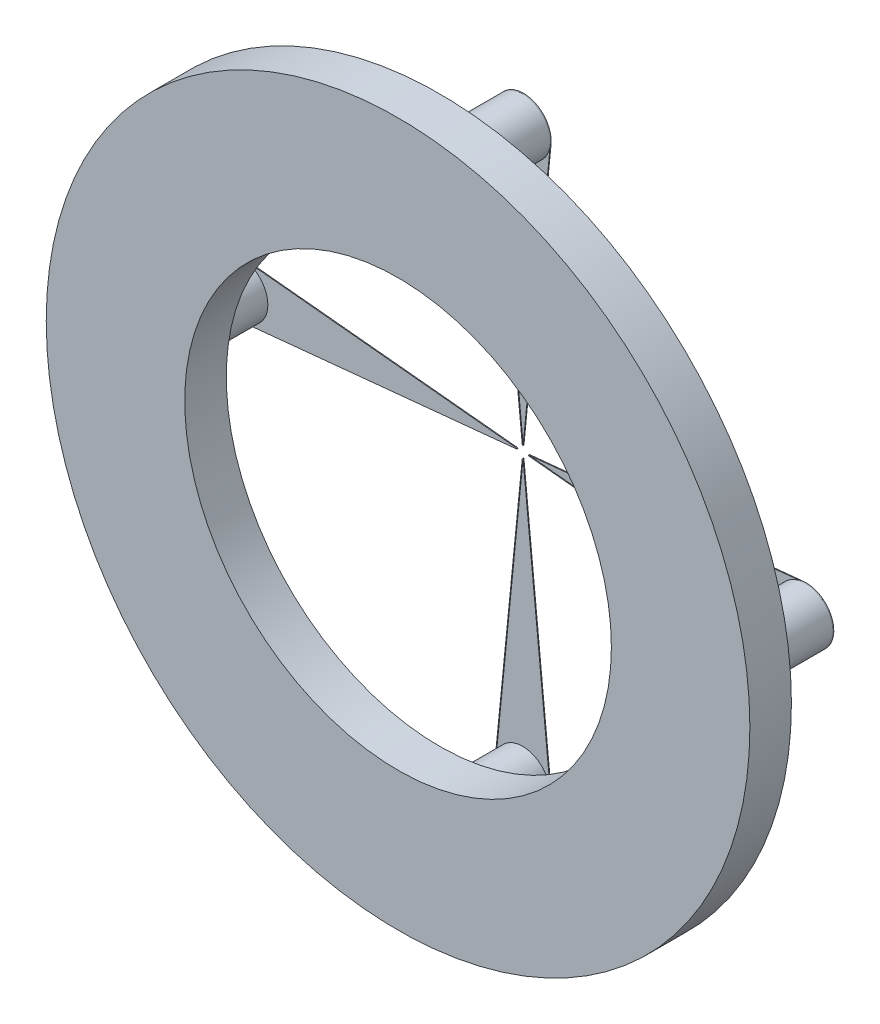
ISO-10303-21;
HEADER;
FILE_DESCRIPTION(('STEP AP214'),'2;1');
FILE_NAME('part.step','',(''),(''),'','','');
FILE_SCHEMA(('AUTOMOTIVE_DESIGN { 1 0 10303 214 1 1 1 1 }'));
ENDSEC;
DATA;
#1=APPLICATION_CONTEXT('core data for automotive mechanical design processes');
#2=APPLICATION_PROTOCOL_DEFINITION('international standard','automotive_design',2000,#1);
#3=PRODUCT_CONTEXT('',#1,'mechanical');
#4=PRODUCT('Part','Part','',(#3));
#5=PRODUCT_RELATED_PRODUCT_CATEGORY('part','',(#4));
#6=PRODUCT_DEFINITION_FORMATION('','',#4);
#7=PRODUCT_DEFINITION_CONTEXT('part definition',#1,'design');
#8=PRODUCT_DEFINITION('design','',#6,#7);
#9=PRODUCT_DEFINITION_SHAPE('','',#8);
#10=(LENGTH_UNIT() NAMED_UNIT(*) SI_UNIT(.MILLI.,.METRE.));
#11=(NAMED_UNIT(*) PLANE_ANGLE_UNIT() SI_UNIT($,.RADIAN.));
#12=(NAMED_UNIT(*) SI_UNIT($,.STERADIAN.) SOLID_ANGLE_UNIT());
#13=UNCERTAINTY_MEASURE_WITH_UNIT(LENGTH_MEASURE(1.E-05),#10,'distance_accuracy_value','');
#14=(GEOMETRIC_REPRESENTATION_CONTEXT(3) GLOBAL_UNCERTAINTY_ASSIGNED_CONTEXT((#13)) GLOBAL_UNIT_ASSIGNED_CONTEXT((#10,
#11,#12)) REPRESENTATION_CONTEXT('',''));
#15=CARTESIAN_POINT('',(0.,0.,0.));
#16=DIRECTION('',(0.,0.,1.));
#17=DIRECTION('',(1.,0.,0.));
#18=AXIS2_PLACEMENT_3D('',#15,#16,#17);
#19=CARTESIAN_POINT('',(0.,0.,3.));
#20=DIRECTION('',(0.,0.,-1.));
#21=DIRECTION('',(-1.,0.,0.));
#22=AXIS2_PLACEMENT_3D('',#19,#20,#21);
#23=CYLINDRICAL_SURFACE('',#22,15.405);
#24=CARTESIAN_POINT('',(0.,0.,3.));
#25=DIRECTION('',(0.,0.,1.));
#26=DIRECTION('',(1.,0.,0.));
#27=AXIS2_PLACEMENT_3D('',#24,#25,#26);
#28=CIRCLE('',#27,15.405);
#29=CARTESIAN_POINT('',(15.405,0.,3.));
#30=VERTEX_POINT('',#29);
#31=EDGE_CURVE('E458',#30,#30,#28,.T.);
#32=ORIENTED_EDGE('',*,*,#31,.T.);
#33=EDGE_LOOP('',(#32));
#34=FACE_BOUND('',#33,.T.);
#35=CARTESIAN_POINT('',(0.,0.,0.));
#36=DIRECTION('',(0.,0.,1.));
#37=DIRECTION('',(1.,0.,0.));
#38=AXIS2_PLACEMENT_3D('',#35,#36,#37);
#39=CIRCLE('',#38,15.405);
#40=CARTESIAN_POINT('',(15.405,0.,0.));
#41=VERTEX_POINT('',#40);
#42=EDGE_CURVE('E457',#41,#41,#39,.T.);
#43=ORIENTED_EDGE('',*,*,#42,.F.);
#44=EDGE_LOOP('',(#43));
#45=FACE_BOUND('',#44,.T.);
#46=ADVANCED_FACE('F150',(#34,#45),#23,.F.);
#47=CARTESIAN_POINT('',(0.,0.,3.));
#48=DIRECTION('',(0.,0.,-1.));
#49=DIRECTION('',(-1.,0.,0.));
#50=AXIS2_PLACEMENT_3D('',#47,#48,#49);
#51=CYLINDRICAL_SURFACE('',#50,25.405);
#52=CARTESIAN_POINT('',(0.,0.,3.));
#53=DIRECTION('',(0.,0.,1.));
#54=DIRECTION('',(1.,0.,0.));
#55=AXIS2_PLACEMENT_3D('',#52,#53,#54);
#56=CIRCLE('',#55,25.405);
#57=CARTESIAN_POINT('',(25.405,0.,3.));
#58=VERTEX_POINT('',#57);
#59=EDGE_CURVE('E462',#58,#58,#56,.T.);
#60=ORIENTED_EDGE('',*,*,#59,.F.);
#61=EDGE_LOOP('',(#60));
#62=FACE_BOUND('',#61,.T.);
#63=CARTESIAN_POINT('',(0.,0.,0.));
#64=DIRECTION('',(0.,0.,1.));
#65=DIRECTION('',(1.,0.,0.));
#66=AXIS2_PLACEMENT_3D('',#63,#64,#65);
#67=CIRCLE('',#66,25.405);
#68=CARTESIAN_POINT('',(25.405,0.,0.));
#69=VERTEX_POINT('',#68);
#70=EDGE_CURVE('E463',#69,#69,#67,.T.);
#71=ORIENTED_EDGE('',*,*,#70,.T.);
#72=EDGE_LOOP('',(#71));
#73=FACE_BOUND('',#72,.T.);
#74=ADVANCED_FACE('F501',(#62,#73),#51,.T.);
#75=CARTESIAN_POINT('',(0.,0.,3.));
#76=DIRECTION('',(0.,0.,1.));
#77=DIRECTION('',(1.,0.,0.));
#78=AXIS2_PLACEMENT_3D('',#75,#76,#77);
#79=PLANE('',#78);
#80=ORIENTED_EDGE('',*,*,#31,.F.);
#81=EDGE_LOOP('',(#80));
#82=FACE_BOUND('',#81,.T.);
#83=ORIENTED_EDGE('',*,*,#59,.T.);
#84=EDGE_LOOP('',(#83));
#85=FACE_BOUND('',#84,.T.);
#86=ADVANCED_FACE('F490',(#82,#85),#79,.T.);
#87=CARTESIAN_POINT('',(0.,0.,0.));
#88=DIRECTION('',(0.,0.,1.));
#89=DIRECTION('',(1.,0.,0.));
#90=AXIS2_PLACEMENT_3D('',#87,#88,#89);
#91=PLANE('',#90);
#92=CARTESIAN_POINT('',(-20.405,0.,0.));
#93=DIRECTION('',(0.,0.,1.));
#94=DIRECTION('',(1.,0.,0.));
#95=AXIS2_PLACEMENT_3D('',#92,#93,#94);
#96=CIRCLE('',#95,2.);
#97=CARTESIAN_POINT('',(-18.405,0.,0.));
#98=VERTEX_POINT('',#97);
#99=EDGE_CURVE('E12',#98,#98,#96,.F.);
#100=ORIENTED_EDGE('',*,*,#99,.F.);
#101=EDGE_LOOP('',(#100));
#102=FACE_BOUND('',#101,.T.);
#103=CARTESIAN_POINT('',(0.,20.405,0.));
#104=DIRECTION('',(0.,0.,1.));
#105=DIRECTION('',(1.,0.,0.));
#106=AXIS2_PLACEMENT_3D('',#103,#104,#105);
#107=CIRCLE('',#106,2.);
#108=CARTESIAN_POINT('',(2.,20.405,0.));
#109=VERTEX_POINT('',#108);
#110=EDGE_CURVE('E159',#109,#109,#107,.F.);
#111=ORIENTED_EDGE('',*,*,#110,.F.);
#112=EDGE_LOOP('',(#111));
#113=FACE_BOUND('',#112,.T.);
#114=CARTESIAN_POINT('',(20.405,0.,0.));
#115=DIRECTION('',(0.,0.,1.));
#116=DIRECTION('',(1.,0.,0.));
#117=AXIS2_PLACEMENT_3D('',#114,#115,#116);
#118=CIRCLE('',#117,2.);
#119=CARTESIAN_POINT('',(22.405,0.,0.));
#120=VERTEX_POINT('',#119);
#121=EDGE_CURVE('E477',#120,#120,#118,.F.);
#122=ORIENTED_EDGE('',*,*,#121,.F.);
#123=EDGE_LOOP('',(#122));
#124=FACE_BOUND('',#123,.T.);
#125=CARTESIAN_POINT('',(0.,-20.405,0.));
#126=DIRECTION('',(0.,0.,1.));
#127=DIRECTION('',(1.,0.,0.));
#128=AXIS2_PLACEMENT_3D('',#125,#126,#127);
#129=CIRCLE('',#128,2.);
#130=CARTESIAN_POINT('',(2.,-20.405,0.));
#131=VERTEX_POINT('',#130);
#132=EDGE_CURVE('E467',#131,#131,#129,.F.);
#133=ORIENTED_EDGE('',*,*,#132,.F.);
#134=EDGE_LOOP('',(#133));
#135=FACE_BOUND('',#134,.T.);
#136=ORIENTED_EDGE('',*,*,#42,.T.);
#137=EDGE_LOOP('',(#136));
#138=FACE_BOUND('',#137,.T.);
#139=ORIENTED_EDGE('',*,*,#70,.F.);
#140=EDGE_LOOP('',(#139));
#141=FACE_BOUND('',#140,.T.);
#142=ADVANCED_FACE('F486',(#102,#113,#124,#135,#138,#141),#91,.F.);
#143=CARTESIAN_POINT('',(0.,-20.405,-6.));
#144=DIRECTION('',(0.,0.,1.));
#145=DIRECTION('',(1.,0.,0.));
#146=AXIS2_PLACEMENT_3D('',#143,#144,#145);
#147=CYLINDRICAL_SURFACE('',#146,2.);
#148=CARTESIAN_POINT('',(0.,-20.405,-6.));
#149=DIRECTION('',(0.,0.,-1.));
#150=DIRECTION('',(-1.,0.,0.));
#151=AXIS2_PLACEMENT_3D('',#148,#149,#150);
#152=CIRCLE('',#151,2.);
#153=CARTESIAN_POINT('',(-2.,-20.405,-6.));
#154=VERTEX_POINT('',#153);
#155=EDGE_CURVE('E453',#154,#154,#152,.T.);
#156=ORIENTED_EDGE('',*,*,#155,.F.);
#157=EDGE_LOOP('',(#156));
#158=FACE_BOUND('',#157,.T.);
#159=ORIENTED_EDGE('',*,*,#132,.T.);
#160=EDGE_LOOP('',(#159));
#161=FACE_BOUND('',#160,.T.);
#162=ADVANCED_FACE('F489',(#158,#161),#147,.T.);
#163=CARTESIAN_POINT('',(20.405,0.,-6.));
#164=DIRECTION('',(0.,0.,1.));
#165=DIRECTION('',(1.,0.,0.));
#166=AXIS2_PLACEMENT_3D('',#163,#164,#165);
#167=CYLINDRICAL_SURFACE('',#166,2.);
#168=CARTESIAN_POINT('',(20.405,0.,-6.));
#169=DIRECTION('',(0.,0.,-1.));
#170=DIRECTION('',(-1.,0.,0.));
#171=AXIS2_PLACEMENT_3D('',#168,#169,#170);
#172=CIRCLE('',#171,2.);
#173=CARTESIAN_POINT('',(18.405,0.,-6.));
#174=VERTEX_POINT('',#173);
#175=EDGE_CURVE('E449',#174,#174,#172,.T.);
#176=ORIENTED_EDGE('',*,*,#175,.F.);
#177=EDGE_LOOP('',(#176));
#178=FACE_BOUND('',#177,.T.);
#179=ORIENTED_EDGE('',*,*,#121,.T.);
#180=EDGE_LOOP('',(#179));
#181=FACE_BOUND('',#180,.T.);
#182=ADVANCED_FACE('F515',(#178,#181),#167,.T.);
#183=CARTESIAN_POINT('',(0.,20.405,-6.));
#184=DIRECTION('',(0.,0.,1.));
#185=DIRECTION('',(1.,0.,0.));
#186=AXIS2_PLACEMENT_3D('',#183,#184,#185);
#187=CYLINDRICAL_SURFACE('',#186,2.);
#188=CARTESIAN_POINT('',(0.,20.405,-6.));
#189=DIRECTION('',(0.,0.,-1.));
#190=DIRECTION('',(-1.,0.,0.));
#191=AXIS2_PLACEMENT_3D('',#188,#189,#190);
#192=CIRCLE('',#191,2.);
#193=CARTESIAN_POINT('',(-2.,20.405,-6.));
#194=VERTEX_POINT('',#193);
#195=EDGE_CURVE('E445',#194,#194,#192,.T.);
#196=ORIENTED_EDGE('',*,*,#195,.F.);
#197=EDGE_LOOP('',(#196));
#198=FACE_BOUND('',#197,.T.);
#199=ORIENTED_EDGE('',*,*,#110,.T.);
#200=EDGE_LOOP('',(#199));
#201=FACE_BOUND('',#200,.T.);
#202=ADVANCED_FACE('F484',(#198,#201),#187,.T.);
#203=CARTESIAN_POINT('',(-20.405,0.,-6.));
#204=DIRECTION('',(0.,0.,1.));
#205=DIRECTION('',(1.,0.,0.));
#206=AXIS2_PLACEMENT_3D('',#203,#204,#205);
#207=CYLINDRICAL_SURFACE('',#206,2.);
#208=ORIENTED_EDGE('',*,*,#99,.T.);
#209=EDGE_LOOP('',(#208));
#210=FACE_BOUND('',#209,.T.);
#211=CARTESIAN_POINT('',(-20.405,0.,-6.));
#212=DIRECTION('',(0.,0.,-1.));
#213=DIRECTION('',(-1.,0.,0.));
#214=AXIS2_PLACEMENT_3D('',#211,#212,#213);
#215=CIRCLE('',#214,2.);
#216=CARTESIAN_POINT('',(-22.405,0.,-6.));
#217=VERTEX_POINT('',#216);
#218=EDGE_CURVE('E441',#217,#217,#215,.T.);
#219=ORIENTED_EDGE('',*,*,#218,.F.);
#220=EDGE_LOOP('',(#219));
#221=FACE_BOUND('',#220,.T.);
#222=ADVANCED_FACE('F522',(#210,#221),#207,.T.);
#223=CARTESIAN_POINT('',(0.00131728861698388,-0.0132853719022991,-6.06));
#224=DIRECTION('',(0.0986694691956302,-0.995120262002866,0.));
#225=DIRECTION('',(0.995120262002866,0.0986694691956302,0.));
#226=AXIS2_PLACEMENT_3D('',#223,#224,#225);
#227=PLANE('',#226);
#228=DIRECTION('',(0.995120262002866,0.0986694691956302,0.));
#229=VECTOR('',#228,1.);
#230=CARTESIAN_POINT('',(0.00131728861698388,-0.0132853719022991,-6.));
#231=LINE('',#230,#229);
#232=CARTESIAN_POINT('',(0.435027571054894,0.0297184387795421,-6.));
#233=VERTEX_POINT('',#232);
#234=CARTESIAN_POINT('',(20.1605443106507,1.98556874212693,-6.));
#235=VERTEX_POINT('',#234);
#236=EDGE_CURVE('E405',#233,#235,#231,.T.);
#237=ORIENTED_EDGE('',*,*,#236,.T.);
#238=DIRECTION('',(0.,0.,1.));
#239=VECTOR('',#238,1.);
#240=CARTESIAN_POINT('',(20.1605443106507,1.98556874212693,-6.06));
#241=LINE('',#240,#239);
#242=CARTESIAN_POINT('',(20.1605443106507,1.98556874212693,-6.06));
#243=VERTEX_POINT('',#242);
#244=EDGE_CURVE('E438',#243,#235,#241,.T.);
#245=ORIENTED_EDGE('',*,*,#244,.F.);
#246=DIRECTION('',(0.995120262002866,0.0986694691956302,0.));
#247=VECTOR('',#246,1.);
#248=CARTESIAN_POINT('',(0.00131728861698388,-0.0132853719022991,-6.06));
#249=LINE('',#248,#247);
#250=CARTESIAN_POINT('',(0.435027571054894,0.0297184387795421,-6.06));
#251=VERTEX_POINT('',#250);
#252=EDGE_CURVE('E406',#251,#243,#249,.T.);
#253=ORIENTED_EDGE('',*,*,#252,.F.);
#254=DIRECTION('',(0.,0.,1.));
#255=VECTOR('',#254,1.);
#256=CARTESIAN_POINT('',(0.435027571054894,0.0297184387795421,-6.06));
#257=LINE('',#256,#255);
#258=EDGE_CURVE('E417',#251,#233,#257,.T.);
#259=ORIENTED_EDGE('',*,*,#258,.T.);
#260=EDGE_LOOP('',(#237,#245,#253,#259));
#261=FACE_BOUND('',#260,.T.);
#262=ADVANCED_FACE('F526',(#261),#227,.F.);
#263=CARTESIAN_POINT('',(20.405,0.,-6.06));
#264=DIRECTION('',(0.,0.,1.));
#265=DIRECTION('',(1.,0.,0.));
#266=AXIS2_PLACEMENT_3D('',#263,#264,#265);
#267=CYLINDRICAL_SURFACE('',#266,2.00056037493667);
#268=CARTESIAN_POINT('',(20.405,0.,-6.));
#269=DIRECTION('',(0.,0.,-1.));
#270=DIRECTION('',(-1.,0.,0.));
#271=AXIS2_PLACEMENT_3D('',#268,#269,#270);
#272=CIRCLE('',#271,2.00056037493667);
#273=CARTESIAN_POINT('',(20.2076610616087,-1.99080364644665,-6.));
#274=VERTEX_POINT('',#273);
#275=EDGE_CURVE('E421',#235,#274,#272,.T.);
#276=ORIENTED_EDGE('',*,*,#275,.T.);
#277=DIRECTION('',(0.,0.,1.));
#278=VECTOR('',#277,1.);
#279=CARTESIAN_POINT('',(20.2076610616087,-1.99080364644665,-6.06));
#280=LINE('',#279,#278);
#281=CARTESIAN_POINT('',(20.2076610616087,-1.99080364644665,-6.06));
#282=VERTEX_POINT('',#281);
#283=EDGE_CURVE('E435',#282,#274,#280,.T.);
#284=ORIENTED_EDGE('',*,*,#283,.F.);
#285=CARTESIAN_POINT('',(20.405,0.,-6.06));
#286=DIRECTION('',(0.,0.,-1.));
#287=DIRECTION('',(-1.,0.,0.));
#288=AXIS2_PLACEMENT_3D('',#285,#286,#287);
#289=CIRCLE('',#288,2.00056037493667);
#290=EDGE_CURVE('E195',#243,#282,#289,.T.);
#291=ORIENTED_EDGE('',*,*,#290,.F.);
#292=ORIENTED_EDGE('',*,*,#244,.T.);
#293=EDGE_LOOP('',(#276,#284,#291,#292));
#294=FACE_BOUND('',#293,.T.);
#295=ADVANCED_FACE('F530',(#294),#267,.T.);
#296=CARTESIAN_POINT('',(0.00126199675749152,0.0127277318323442,-6.06));
#297=DIRECTION('',(-0.0986694691956303,-0.995120262002866,0.));
#298=DIRECTION('',(0.995120262002866,-0.0986694691956303,0.));
#299=AXIS2_PLACEMENT_3D('',#296,#297,#298);
#300=PLANE('',#299);
#301=DIRECTION('',(0.995120262002866,-0.0986694691956303,0.));
#302=VECTOR('',#301,1.);
#303=CARTESIAN_POINT('',(0.00126199675749152,0.0127277318323442,-6.));
#304=LINE('',#303,#302);
#305=CARTESIAN_POINT('',(0.435027571054894,-0.0302815612204578,-6.));
#306=VERTEX_POINT('',#305);
#307=EDGE_CURVE('E425',#306,#274,#304,.T.);
#308=ORIENTED_EDGE('',*,*,#307,.F.);
#309=DIRECTION('',(0.,0.,1.));
#310=VECTOR('',#309,1.);
#311=CARTESIAN_POINT('',(0.435027571054894,-0.0302815612204578,-6.06));
#312=LINE('',#311,#310);
#313=CARTESIAN_POINT('',(0.435027571054894,-0.0302815612204578,-6.06));
#314=VERTEX_POINT('',#313);
#315=EDGE_CURVE('E184',#314,#306,#312,.T.);
#316=ORIENTED_EDGE('',*,*,#315,.F.);
#317=DIRECTION('',(0.995120262002866,-0.0986694691956303,0.));
#318=VECTOR('',#317,1.);
#319=CARTESIAN_POINT('',(0.00126199675749152,0.0127277318323442,-6.06));
#320=LINE('',#319,#318);
#321=EDGE_CURVE('E411',#314,#282,#320,.T.);
#322=ORIENTED_EDGE('',*,*,#321,.T.);
#323=ORIENTED_EDGE('',*,*,#283,.T.);
#324=EDGE_LOOP('',(#308,#316,#322,#323));
#325=FACE_BOUND('',#324,.T.);
#326=ADVANCED_FACE('F534',(#325),#300,.T.);
#327=CARTESIAN_POINT('',(0.435027571054894,-0.000281561220457859,-6.06));
#328=DIRECTION('',(0.,0.,1.));
#329=DIRECTION('',(1.,0.,0.));
#330=AXIS2_PLACEMENT_3D('',#327,#328,#329);
#331=CYLINDRICAL_SURFACE('',#330,0.03);
#332=CARTESIAN_POINT('',(0.435027571054894,-0.000281561220457859,-6.));
#333=DIRECTION('',(0.,0.,-1.));
#334=DIRECTION('',(-1.,0.,0.));
#335=AXIS2_PLACEMENT_3D('',#332,#333,#334);
#336=CIRCLE('',#335,0.03);
#337=EDGE_CURVE('E187',#306,#233,#336,.T.);
#338=ORIENTED_EDGE('',*,*,#337,.T.);
#339=ORIENTED_EDGE('',*,*,#258,.F.);
#340=CARTESIAN_POINT('',(0.435027571054894,-0.000281561220457859,-6.06));
#341=DIRECTION('',(0.,0.,-1.));
#342=DIRECTION('',(-1.,0.,0.));
#343=AXIS2_PLACEMENT_3D('',#340,#341,#342);
#344=CIRCLE('',#343,0.03);
#345=EDGE_CURVE('E167',#314,#251,#344,.T.);
#346=ORIENTED_EDGE('',*,*,#345,.F.);
#347=ORIENTED_EDGE('',*,*,#315,.T.);
#348=EDGE_LOOP('',(#338,#339,#346,#347));
#349=FACE_BOUND('',#348,.T.);
#350=ADVANCED_FACE('F537',(#349),#331,.T.);
#351=CARTESIAN_POINT('',(0.,0.,-6.06));
#352=DIRECTION('',(0.,0.,-1.));
#353=DIRECTION('',(-1.,0.,0.));
#354=AXIS2_PLACEMENT_3D('',#351,#352,#353);
#355=PLANE('',#354);
#356=ORIENTED_EDGE('',*,*,#252,.T.);
#357=ORIENTED_EDGE('',*,*,#290,.T.);
#358=ORIENTED_EDGE('',*,*,#321,.F.);
#359=ORIENTED_EDGE('',*,*,#345,.T.);
#360=EDGE_LOOP('',(#356,#357,#358,#359));
#361=FACE_BOUND('',#360,.T.);
#362=ADVANCED_FACE('F541',(#361),#355,.T.);
#363=CARTESIAN_POINT('',(0.,0.,-6.));
#364=DIRECTION('',(0.,0.,-1.));
#365=DIRECTION('',(-1.,0.,0.));
#366=AXIS2_PLACEMENT_3D('',#363,#364,#365);
#367=PLANE('',#366);
#368=ORIENTED_EDGE('',*,*,#175,.T.);
#369=EDGE_LOOP('',(#368));
#370=FACE_BOUND('',#369,.T.);
#371=ORIENTED_EDGE('',*,*,#236,.F.);
#372=ORIENTED_EDGE('',*,*,#337,.F.);
#373=ORIENTED_EDGE('',*,*,#307,.T.);
#374=ORIENTED_EDGE('',*,*,#275,.F.);
#375=EDGE_LOOP('',(#371,#372,#373,#374));
#376=FACE_BOUND('',#375,.T.);
#377=ADVANCED_FACE('F542',(#370,#376),#367,.F.);
#378=CARTESIAN_POINT('',(-0.0127277318323442,0.00126199675749148,-6.06));
#379=DIRECTION('',(0.995120262002866,-0.0986694691956268,0.));
#380=DIRECTION('',(0.0986694691956268,0.995120262002866,0.));
#381=AXIS2_PLACEMENT_3D('',#378,#379,#380);
#382=PLANE('',#381);
#383=DIRECTION('',(0.0986694691956268,0.995120262002866,0.));
#384=VECTOR('',#383,1.);
#385=CARTESIAN_POINT('',(-0.0127277318323442,0.00126199675749148,-6.));
#386=LINE('',#385,#384);
#387=CARTESIAN_POINT('',(0.0302815612204563,0.435027571054894,-6.));
#388=VERTEX_POINT('',#387);
#389=CARTESIAN_POINT('',(1.99080364644657,20.2076610616087,-6.));
#390=VERTEX_POINT('',#389);
#391=EDGE_CURVE('E364',#388,#390,#386,.T.);
#392=ORIENTED_EDGE('',*,*,#391,.F.);
#393=DIRECTION('',(0.,0.,1.));
#394=VECTOR('',#393,1.);
#395=CARTESIAN_POINT('',(0.0302815612204563,0.435027571054894,-6.06));
#396=LINE('',#395,#394);
#397=CARTESIAN_POINT('',(0.0302815612204563,0.435027571054894,-6.06));
#398=VERTEX_POINT('',#397);
#399=EDGE_CURVE('E402',#398,#388,#396,.T.);
#400=ORIENTED_EDGE('',*,*,#399,.F.);
#401=DIRECTION('',(0.0986694691956268,0.995120262002866,0.));
#402=VECTOR('',#401,1.);
#403=CARTESIAN_POINT('',(-0.0127277318323442,0.00126199675749148,-6.06));
#404=LINE('',#403,#402);
#405=CARTESIAN_POINT('',(1.99080364644657,20.2076610616087,-6.06));
#406=VERTEX_POINT('',#405);
#407=EDGE_CURVE('E365',#398,#406,#404,.T.);
#408=ORIENTED_EDGE('',*,*,#407,.T.);
#409=DIRECTION('',(0.,0.,1.));
#410=VECTOR('',#409,1.);
#411=CARTESIAN_POINT('',(1.99080364644657,20.2076610616087,-6.06));
#412=LINE('',#411,#410);
#413=EDGE_CURVE('E379',#406,#390,#412,.T.);
#414=ORIENTED_EDGE('',*,*,#413,.T.);
#415=EDGE_LOOP('',(#392,#400,#408,#414));
#416=FACE_BOUND('',#415,.T.);
#417=ADVANCED_FACE('F545',(#416),#382,.T.);
#418=CARTESIAN_POINT('',(0.00028156122045634,0.435027571054894,-6.06));
#419=DIRECTION('',(0.,0.,1.));
#420=DIRECTION('',(1.,0.,0.));
#421=AXIS2_PLACEMENT_3D('',#418,#419,#420);
#422=CYLINDRICAL_SURFACE('',#421,0.03);
#423=CARTESIAN_POINT('',(0.00028156122045634,0.435027571054894,-6.));
#424=DIRECTION('',(0.,0.,-1.));
#425=DIRECTION('',(-1.,0.,0.));
#426=AXIS2_PLACEMENT_3D('',#423,#424,#425);
#427=CIRCLE('',#426,0.03);
#428=CARTESIAN_POINT('',(-0.0297184387795436,0.435027571054894,-6.));
#429=VERTEX_POINT('',#428);
#430=EDGE_CURVE('E383',#388,#429,#427,.T.);
#431=ORIENTED_EDGE('',*,*,#430,.T.);
#432=DIRECTION('',(0.,0.,1.));
#433=VECTOR('',#432,1.);
#434=CARTESIAN_POINT('',(-0.0297184387795436,0.435027571054894,-6.06));
#435=LINE('',#434,#433);
#436=CARTESIAN_POINT('',(-0.0297184387795436,0.435027571054894,-6.06));
#437=VERTEX_POINT('',#436);
#438=EDGE_CURVE('E398',#437,#429,#435,.T.);
#439=ORIENTED_EDGE('',*,*,#438,.F.);
#440=CARTESIAN_POINT('',(0.00028156122045634,0.435027571054894,-6.06));
#441=DIRECTION('',(0.,0.,-1.));
#442=DIRECTION('',(-1.,0.,0.));
#443=AXIS2_PLACEMENT_3D('',#440,#441,#442);
#444=CIRCLE('',#443,0.03);
#445=EDGE_CURVE('E369',#398,#437,#444,.T.);
#446=ORIENTED_EDGE('',*,*,#445,.F.);
#447=ORIENTED_EDGE('',*,*,#399,.T.);
#448=EDGE_LOOP('',(#431,#439,#446,#447));
#449=FACE_BOUND('',#448,.T.);
#450=ADVANCED_FACE('F551',(#449),#422,.T.);
#451=CARTESIAN_POINT('',(0.0132853719022991,0.00131728861698393,-6.06));
#452=DIRECTION('',(0.995120262002866,0.0986694691956337,0.));
#453=DIRECTION('',(-0.0986694691956337,0.995120262002866,0.));
#454=AXIS2_PLACEMENT_3D('',#451,#452,#453);
#455=PLANE('',#454);
#456=DIRECTION('',(-0.0986694691956337,0.995120262002866,0.));
#457=VECTOR('',#456,1.);
#458=CARTESIAN_POINT('',(0.0132853719022991,0.00131728861698393,-6.));
#459=LINE('',#458,#457);
#460=CARTESIAN_POINT('',(-1.98556874212671,20.1605443106477,-6.));
#461=VERTEX_POINT('',#460);
#462=EDGE_CURVE('E386',#429,#461,#459,.T.);
#463=ORIENTED_EDGE('',*,*,#462,.T.);
#464=DIRECTION('',(0.,0.,1.));
#465=VECTOR('',#464,1.);
#466=CARTESIAN_POINT('',(-1.98556874212671,20.1605443106477,-6.06));
#467=LINE('',#466,#465);
#468=CARTESIAN_POINT('',(-1.98556874212671,20.1605443106477,-6.06));
#469=VERTEX_POINT('',#468);
#470=EDGE_CURVE('E394',#469,#461,#467,.T.);
#471=ORIENTED_EDGE('',*,*,#470,.F.);
#472=DIRECTION('',(-0.0986694691956337,0.995120262002866,0.));
#473=VECTOR('',#472,1.);
#474=CARTESIAN_POINT('',(0.0132853719022991,0.00131728861698393,-6.06));
#475=LINE('',#474,#473);
#476=EDGE_CURVE('E373',#437,#469,#475,.T.);
#477=ORIENTED_EDGE('',*,*,#476,.F.);
#478=ORIENTED_EDGE('',*,*,#438,.T.);
#479=EDGE_LOOP('',(#463,#471,#477,#478));
#480=FACE_BOUND('',#479,.T.);
#481=ADVANCED_FACE('F555',(#480),#455,.F.);
#482=CARTESIAN_POINT('',(0.,20.405,-6.06));
#483=DIRECTION('',(0.,0.,1.));
#484=DIRECTION('',(1.,0.,0.));
#485=AXIS2_PLACEMENT_3D('',#482,#483,#484);
#486=CYLINDRICAL_SURFACE('',#485,2.00056037493674);
#487=CARTESIAN_POINT('',(0.,20.405,-6.));
#488=DIRECTION('',(0.,0.,-1.));
#489=DIRECTION('',(-1.,0.,0.));
#490=AXIS2_PLACEMENT_3D('',#487,#488,#489);
#491=CIRCLE('',#490,2.00056037493674);
#492=EDGE_CURVE('E370',#461,#390,#491,.T.);
#493=ORIENTED_EDGE('',*,*,#492,.T.);
#494=ORIENTED_EDGE('',*,*,#413,.F.);
#495=CARTESIAN_POINT('',(0.,20.405,-6.06));
#496=DIRECTION('',(0.,0.,-1.));
#497=DIRECTION('',(-1.,0.,0.));
#498=AXIS2_PLACEMENT_3D('',#495,#496,#497);
#499=CIRCLE('',#498,2.00056037493674);
#500=EDGE_CURVE('E376',#469,#406,#499,.T.);
#501=ORIENTED_EDGE('',*,*,#500,.F.);
#502=ORIENTED_EDGE('',*,*,#470,.T.);
#503=EDGE_LOOP('',(#493,#494,#501,#502));
#504=FACE_BOUND('',#503,.T.);
#505=ADVANCED_FACE('F559',(#504),#486,.T.);
#506=CARTESIAN_POINT('',(0.,0.,-6.06));
#507=DIRECTION('',(0.,0.,-1.));
#508=DIRECTION('',(-1.,0.,0.));
#509=AXIS2_PLACEMENT_3D('',#506,#507,#508);
#510=PLANE('',#509);
#511=ORIENTED_EDGE('',*,*,#407,.F.);
#512=ORIENTED_EDGE('',*,*,#445,.T.);
#513=ORIENTED_EDGE('',*,*,#476,.T.);
#514=ORIENTED_EDGE('',*,*,#500,.T.);
#515=EDGE_LOOP('',(#511,#512,#513,#514));
#516=FACE_BOUND('',#515,.T.);
#517=ADVANCED_FACE('F563',(#516),#510,.T.);
#518=CARTESIAN_POINT('',(0.,0.,-6.));
#519=DIRECTION('',(0.,0.,-1.));
#520=DIRECTION('',(-1.,0.,0.));
#521=AXIS2_PLACEMENT_3D('',#518,#519,#520);
#522=PLANE('',#521);
#523=ORIENTED_EDGE('',*,*,#195,.T.);
#524=EDGE_LOOP('',(#523));
#525=FACE_BOUND('',#524,.T.);
#526=ORIENTED_EDGE('',*,*,#391,.T.);
#527=ORIENTED_EDGE('',*,*,#492,.F.);
#528=ORIENTED_EDGE('',*,*,#462,.F.);
#529=ORIENTED_EDGE('',*,*,#430,.F.);
#530=EDGE_LOOP('',(#526,#527,#528,#529));
#531=FACE_BOUND('',#530,.T.);
#532=ADVANCED_FACE('F565',(#525,#531),#522,.F.);
#533=CARTESIAN_POINT('',(-0.00126199675749144,-0.0127277318323442,-6.06));
#534=DIRECTION('',(0.0986694691956233,0.995120262002867,0.));
#535=DIRECTION('',(-0.995120262002867,0.0986694691956233,0.));
#536=AXIS2_PLACEMENT_3D('',#533,#534,#535);
#537=PLANE('',#536);
#538=DIRECTION('',(-0.995120262002867,0.0986694691956233,0.));
#539=VECTOR('',#538,1.);
#540=CARTESIAN_POINT('',(-0.00126199675749144,-0.0127277318323442,-6.));
#541=LINE('',#540,#539);
#542=CARTESIAN_POINT('',(-0.435027571054894,0.0302815612204548,-6.));
#543=VERTEX_POINT('',#542);
#544=CARTESIAN_POINT('',(-20.2076610616087,1.99080364644651,-6.));
#545=VERTEX_POINT('',#544);
#546=EDGE_CURVE('E280',#543,#545,#541,.T.);
#547=ORIENTED_EDGE('',*,*,#546,.F.);
#548=DIRECTION('',(0.,0.,1.));
#549=VECTOR('',#548,1.);
#550=CARTESIAN_POINT('',(-0.435027571054894,0.0302815612204548,-6.06));
#551=LINE('',#550,#549);
#552=CARTESIAN_POINT('',(-0.435027571054894,0.0302815612204548,-6.06));
#553=VERTEX_POINT('',#552);
#554=EDGE_CURVE('E361',#553,#543,#551,.T.);
#555=ORIENTED_EDGE('',*,*,#554,.F.);
#556=DIRECTION('',(-0.995120262002867,0.0986694691956233,0.));
#557=VECTOR('',#556,1.);
#558=CARTESIAN_POINT('',(-0.00126199675749144,-0.0127277318323442,-6.06));
#559=LINE('',#558,#557);
#560=CARTESIAN_POINT('',(-20.2076610616087,1.99080364644651,-6.06));
#561=VERTEX_POINT('',#560);
#562=EDGE_CURVE('E324',#553,#561,#559,.T.);
#563=ORIENTED_EDGE('',*,*,#562,.T.);
#564=DIRECTION('',(0.,0.,1.));
#565=VECTOR('',#564,1.);
#566=CARTESIAN_POINT('',(-20.2076610616087,1.99080364644651,-6.06));
#567=LINE('',#566,#565);
#568=EDGE_CURVE('E338',#561,#545,#567,.T.);
#569=ORIENTED_EDGE('',*,*,#568,.T.);
#570=EDGE_LOOP('',(#547,#555,#563,#569));
#571=FACE_BOUND('',#570,.T.);
#572=ADVANCED_FACE('F568',(#571),#537,.T.);
#573=CARTESIAN_POINT('',(-0.435027571054894,0.000281561220454821,-6.06));
#574=DIRECTION('',(0.,0.,1.));
#575=DIRECTION('',(1.,0.,0.));
#576=AXIS2_PLACEMENT_3D('',#573,#574,#575);
#577=CYLINDRICAL_SURFACE('',#576,0.03);
#578=CARTESIAN_POINT('',(-0.435027571054894,0.000281561220454821,-6.));
#579=DIRECTION('',(0.,0.,-1.));
#580=DIRECTION('',(-1.,0.,0.));
#581=AXIS2_PLACEMENT_3D('',#578,#579,#580);
#582=CIRCLE('',#581,0.03);
#583=CARTESIAN_POINT('',(-0.435027571054894,-0.0297184387795452,-6.));
#584=VERTEX_POINT('',#583);
#585=EDGE_CURVE('E342',#543,#584,#582,.T.);
#586=ORIENTED_EDGE('',*,*,#585,.T.);
#587=DIRECTION('',(0.,0.,1.));
#588=VECTOR('',#587,1.);
#589=CARTESIAN_POINT('',(-0.435027571054894,-0.0297184387795452,-6.06));
#590=LINE('',#589,#588);
#591=CARTESIAN_POINT('',(-0.435027571054894,-0.0297184387795452,-6.06));
#592=VERTEX_POINT('',#591);
#593=EDGE_CURVE('E357',#592,#584,#590,.T.);
#594=ORIENTED_EDGE('',*,*,#593,.F.);
#595=CARTESIAN_POINT('',(-0.435027571054894,0.000281561220454821,-6.06));
#596=DIRECTION('',(0.,0.,-1.));
#597=DIRECTION('',(-1.,0.,0.));
#598=AXIS2_PLACEMENT_3D('',#595,#596,#597);
#599=CIRCLE('',#598,0.03);
#600=EDGE_CURVE('E328',#553,#592,#599,.T.);
#601=ORIENTED_EDGE('',*,*,#600,.F.);
#602=ORIENTED_EDGE('',*,*,#554,.T.);
#603=EDGE_LOOP('',(#586,#594,#601,#602));
#604=FACE_BOUND('',#603,.T.);
#605=ADVANCED_FACE('F575',(#604),#577,.T.);
#606=CARTESIAN_POINT('',(-0.00131728861698397,0.0132853719022991,-6.06));
#607=DIRECTION('',(-0.0986694691956372,0.995120262002865,0.));
#608=DIRECTION('',(-0.995120262002865,-0.0986694691956372,0.));
#609=AXIS2_PLACEMENT_3D('',#606,#607,#608);
#610=PLANE('',#609);
#611=DIRECTION('',(-0.995120262002865,-0.0986694691956372,0.));
#612=VECTOR('',#611,1.);
#613=CARTESIAN_POINT('',(-0.00131728861698397,0.0132853719022991,-6.));
#614=LINE('',#613,#612);
#615=CARTESIAN_POINT('',(-20.1605443106477,-1.98556874212677,-6.));
#616=VERTEX_POINT('',#615);
#617=EDGE_CURVE('E345',#584,#616,#614,.T.);
#618=ORIENTED_EDGE('',*,*,#617,.T.);
#619=DIRECTION('',(0.,0.,1.));
#620=VECTOR('',#619,1.);
#621=CARTESIAN_POINT('',(-20.1605443106477,-1.98556874212677,-6.06));
#622=LINE('',#621,#620);
#623=CARTESIAN_POINT('',(-20.1605443106477,-1.98556874212677,-6.06));
#624=VERTEX_POINT('',#623);
#625=EDGE_CURVE('E353',#624,#616,#622,.T.);
#626=ORIENTED_EDGE('',*,*,#625,.F.);
#627=DIRECTION('',(-0.995120262002865,-0.0986694691956372,0.));
#628=VECTOR('',#627,1.);
#629=CARTESIAN_POINT('',(-0.00131728861698397,0.0132853719022991,-6.06));
#630=LINE('',#629,#628);
#631=EDGE_CURVE('E332',#592,#624,#630,.T.);
#632=ORIENTED_EDGE('',*,*,#631,.F.);
#633=ORIENTED_EDGE('',*,*,#593,.T.);
#634=EDGE_LOOP('',(#618,#626,#632,#633));
#635=FACE_BOUND('',#634,.T.);
#636=ADVANCED_FACE('F579',(#635),#610,.F.);
#637=CARTESIAN_POINT('',(-20.405,-1.42487353438188E-13,-6.06));
#638=DIRECTION('',(0.,0.,1.));
#639=DIRECTION('',(1.,0.,0.));
#640=AXIS2_PLACEMENT_3D('',#637,#638,#639);
#641=CYLINDRICAL_SURFACE('',#640,2.00056037493674);
#642=CARTESIAN_POINT('',(-20.405,-1.42487353438188E-13,-6.));
#643=DIRECTION('',(0.,0.,-1.));
#644=DIRECTION('',(-1.,0.,0.));
#645=AXIS2_PLACEMENT_3D('',#642,#643,#644);
#646=CIRCLE('',#645,2.00056037493674);
#647=EDGE_CURVE('E329',#616,#545,#646,.T.);
#648=ORIENTED_EDGE('',*,*,#647,.T.);
#649=ORIENTED_EDGE('',*,*,#568,.F.);
#650=CARTESIAN_POINT('',(-20.405,-1.42487353438188E-13,-6.06));
#651=DIRECTION('',(0.,0.,-1.));
#652=DIRECTION('',(-1.,0.,0.));
#653=AXIS2_PLACEMENT_3D('',#650,#651,#652);
#654=CIRCLE('',#653,2.00056037493674);
#655=EDGE_CURVE('E335',#624,#561,#654,.T.);
#656=ORIENTED_EDGE('',*,*,#655,.F.);
#657=ORIENTED_EDGE('',*,*,#625,.T.);
#658=EDGE_LOOP('',(#648,#649,#656,#657));
#659=FACE_BOUND('',#658,.T.);
#660=ADVANCED_FACE('F583',(#659),#641,.T.);
#661=CARTESIAN_POINT('',(0.,0.,-6.06));
#662=DIRECTION('',(0.,0.,-1.));
#663=DIRECTION('',(-1.,0.,0.));
#664=AXIS2_PLACEMENT_3D('',#661,#662,#663);
#665=PLANE('',#664);
#666=ORIENTED_EDGE('',*,*,#562,.F.);
#667=ORIENTED_EDGE('',*,*,#600,.T.);
#668=ORIENTED_EDGE('',*,*,#631,.T.);
#669=ORIENTED_EDGE('',*,*,#655,.T.);
#670=EDGE_LOOP('',(#666,#667,#668,#669));
#671=FACE_BOUND('',#670,.T.);
#672=ADVANCED_FACE('F587',(#671),#665,.T.);
#673=CARTESIAN_POINT('',(0.,0.,-6.));
#674=DIRECTION('',(0.,0.,-1.));
#675=DIRECTION('',(-1.,0.,0.));
#676=AXIS2_PLACEMENT_3D('',#673,#674,#675);
#677=PLANE('',#676);
#678=ORIENTED_EDGE('',*,*,#218,.T.);
#679=EDGE_LOOP('',(#678));
#680=FACE_BOUND('',#679,.T.);
#681=ORIENTED_EDGE('',*,*,#546,.T.);
#682=ORIENTED_EDGE('',*,*,#647,.F.);
#683=ORIENTED_EDGE('',*,*,#617,.F.);
#684=ORIENTED_EDGE('',*,*,#585,.F.);
#685=EDGE_LOOP('',(#681,#682,#683,#684));
#686=FACE_BOUND('',#685,.T.);
#687=ADVANCED_FACE('F589',(#680,#686),#677,.F.);
#688=CARTESIAN_POINT('',(0.0127277318323442,-0.00126199675749139,-6.06));
#689=DIRECTION('',(-0.995120262002867,0.0986694691956198,0.));
#690=DIRECTION('',(-0.0986694691956198,-0.995120262002867,0.));
#691=AXIS2_PLACEMENT_3D('',#688,#689,#690);
#692=PLANE('',#691);
#693=DIRECTION('',(-0.0986694691956198,-0.995120262002867,0.));
#694=VECTOR('',#693,1.);
#695=CARTESIAN_POINT('',(0.0127277318323442,-0.00126199675749139,-6.));
#696=LINE('',#695,#694);
#697=CARTESIAN_POINT('',(-0.0302815612204533,-0.435027571054894,-6.));
#698=VERTEX_POINT('',#697);
#699=CARTESIAN_POINT('',(-1.99080364644643,-20.2076610616087,-6.));
#700=VERTEX_POINT('',#699);
#701=EDGE_CURVE('E276',#698,#700,#696,.T.);
#702=ORIENTED_EDGE('',*,*,#701,.F.);
#703=DIRECTION('',(0.,0.,1.));
#704=VECTOR('',#703,1.);
#705=CARTESIAN_POINT('',(-0.0302815612204533,-0.435027571054894,-6.06));
#706=LINE('',#705,#704);
#707=CARTESIAN_POINT('',(-0.0302815612204533,-0.435027571054894,-6.06));
#708=VERTEX_POINT('',#707);
#709=EDGE_CURVE('E270',#708,#698,#706,.T.);
#710=ORIENTED_EDGE('',*,*,#709,.F.);
#711=DIRECTION('',(-0.0986694691956198,-0.995120262002867,0.));
#712=VECTOR('',#711,1.);
#713=CARTESIAN_POINT('',(0.0127277318323442,-0.00126199675749139,-6.06));
#714=LINE('',#713,#712);
#715=CARTESIAN_POINT('',(-1.99080364644643,-20.2076610616087,-6.06));
#716=VERTEX_POINT('',#715);
#717=EDGE_CURVE('E274',#708,#716,#714,.T.);
#718=ORIENTED_EDGE('',*,*,#717,.T.);
#719=DIRECTION('',(0.,0.,1.));
#720=VECTOR('',#719,1.);
#721=CARTESIAN_POINT('',(-1.99080364644643,-20.2076610616087,-6.06));
#722=LINE('',#721,#720);
#723=EDGE_CURVE('E308',#716,#700,#722,.T.);
#724=ORIENTED_EDGE('',*,*,#723,.T.);
#725=EDGE_LOOP('',(#702,#710,#718,#724));
#726=FACE_BOUND('',#725,.T.);
#727=ADVANCED_FACE('F272',(#726),#692,.T.);
#728=CARTESIAN_POINT('',(-0.000281561220453302,-0.435027571054894,-6.06));
#729=DIRECTION('',(0.,0.,1.));
#730=DIRECTION('',(1.,0.,0.));
#731=AXIS2_PLACEMENT_3D('',#728,#729,#730);
#732=CYLINDRICAL_SURFACE('',#731,0.03);
#733=CARTESIAN_POINT('',(-0.000281561220453302,-0.435027571054894,-6.));
#734=DIRECTION('',(0.,0.,-1.));
#735=DIRECTION('',(-1.,0.,0.));
#736=AXIS2_PLACEMENT_3D('',#733,#734,#735);
#737=CIRCLE('',#736,0.03);
#738=CARTESIAN_POINT('',(0.0297184387795467,-0.435027571054894,-6.));
#739=VERTEX_POINT('',#738);
#740=EDGE_CURVE('E311',#698,#739,#737,.T.);
#741=ORIENTED_EDGE('',*,*,#740,.T.);
#742=DIRECTION('',(0.,0.,1.));
#743=VECTOR('',#742,1.);
#744=CARTESIAN_POINT('',(0.0297184387795467,-0.435027571054894,-6.06));
#745=LINE('',#744,#743);
#746=CARTESIAN_POINT('',(0.0297184387795467,-0.435027571054894,-6.06));
#747=VERTEX_POINT('',#746);
#748=EDGE_CURVE('E281',#747,#739,#745,.T.);
#749=ORIENTED_EDGE('',*,*,#748,.F.);
#750=CARTESIAN_POINT('',(-0.000281561220453302,-0.435027571054894,-6.06));
#751=DIRECTION('',(0.,0.,-1.));
#752=DIRECTION('',(-1.,0.,0.));
#753=AXIS2_PLACEMENT_3D('',#750,#751,#752);
#754=CIRCLE('',#753,0.03);
#755=EDGE_CURVE('E284',#708,#747,#754,.T.);
#756=ORIENTED_EDGE('',*,*,#755,.F.);
#757=ORIENTED_EDGE('',*,*,#709,.T.);
#758=EDGE_LOOP('',(#741,#749,#756,#757));
#759=FACE_BOUND('',#758,.T.);
#760=ADVANCED_FACE('F285',(#759),#732,.T.);
#761=CARTESIAN_POINT('',(-0.0132853719022991,-0.00131728861698402,-6.06));
#762=DIRECTION('',(-0.995120262002865,-0.0986694691956406,0.));
#763=DIRECTION('',(0.0986694691956406,-0.995120262002865,0.));
#764=AXIS2_PLACEMENT_3D('',#761,#762,#763);
#765=PLANE('',#764);
#766=DIRECTION('',(0.0986694691956406,-0.995120262002865,0.));
#767=VECTOR('',#766,1.);
#768=CARTESIAN_POINT('',(-0.0132853719022991,-0.00131728861698402,-6.));
#769=LINE('',#768,#767);
#770=CARTESIAN_POINT('',(1.98556874212685,-20.1605443106477,-6.));
#771=VERTEX_POINT('',#770);
#772=EDGE_CURVE('E301',#739,#771,#769,.T.);
#773=ORIENTED_EDGE('',*,*,#772,.T.);
#774=DIRECTION('',(0.,0.,1.));
#775=VECTOR('',#774,1.);
#776=CARTESIAN_POINT('',(1.98556874212685,-20.1605443106477,-6.06));
#777=LINE('',#776,#775);
#778=CARTESIAN_POINT('',(1.98556874212685,-20.1605443106477,-6.06));
#779=VERTEX_POINT('',#778);
#780=EDGE_CURVE('E318',#779,#771,#777,.T.);
#781=ORIENTED_EDGE('',*,*,#780,.F.);
#782=DIRECTION('',(0.0986694691956406,-0.995120262002865,0.));
#783=VECTOR('',#782,1.);
#784=CARTESIAN_POINT('',(-0.0132853719022991,-0.00131728861698402,-6.06));
#785=LINE('',#784,#783);
#786=EDGE_CURVE('E290',#747,#779,#785,.T.);
#787=ORIENTED_EDGE('',*,*,#786,.F.);
#788=ORIENTED_EDGE('',*,*,#748,.T.);
#789=EDGE_LOOP('',(#773,#781,#787,#788));
#790=FACE_BOUND('',#789,.T.);
#791=ADVANCED_FACE('F600',(#790),#765,.F.);
#792=CARTESIAN_POINT('',(2.13731030157282E-13,-20.405,-6.06));
#793=DIRECTION('',(0.,0.,1.));
#794=DIRECTION('',(1.,0.,0.));
#795=AXIS2_PLACEMENT_3D('',#792,#793,#794);
#796=CYLINDRICAL_SURFACE('',#795,2.00056037493674);
#797=CARTESIAN_POINT('',(2.13731030157282E-13,-20.405,-6.));
#798=DIRECTION('',(0.,0.,-1.));
#799=DIRECTION('',(-1.,0.,0.));
#800=AXIS2_PLACEMENT_3D('',#797,#798,#799);
#801=CIRCLE('',#800,2.00056037493674);
#802=EDGE_CURVE('E297',#771,#700,#801,.T.);
#803=ORIENTED_EDGE('',*,*,#802,.T.);
#804=ORIENTED_EDGE('',*,*,#723,.F.);
#805=CARTESIAN_POINT('',(2.13731030157282E-13,-20.405,-6.06));
#806=DIRECTION('',(0.,0.,-1.));
#807=DIRECTION('',(-1.,0.,0.));
#808=AXIS2_PLACEMENT_3D('',#805,#806,#807);
#809=CIRCLE('',#808,2.00056037493674);
#810=EDGE_CURVE('E294',#779,#716,#809,.T.);
#811=ORIENTED_EDGE('',*,*,#810,.F.);
#812=ORIENTED_EDGE('',*,*,#780,.T.);
#813=EDGE_LOOP('',(#803,#804,#811,#812));
#814=FACE_BOUND('',#813,.T.);
#815=ADVANCED_FACE('F603',(#814),#796,.T.);
#816=CARTESIAN_POINT('',(0.,0.,-6.06));
#817=DIRECTION('',(0.,0.,-1.));
#818=DIRECTION('',(-1.,0.,0.));
#819=AXIS2_PLACEMENT_3D('',#816,#817,#818);
#820=PLANE('',#819);
#821=ORIENTED_EDGE('',*,*,#717,.F.);
#822=ORIENTED_EDGE('',*,*,#755,.T.);
#823=ORIENTED_EDGE('',*,*,#786,.T.);
#824=ORIENTED_EDGE('',*,*,#810,.T.);
#825=EDGE_LOOP('',(#821,#822,#823,#824));
#826=FACE_BOUND('',#825,.T.);
#827=ADVANCED_FACE('F292',(#826),#820,.T.);
#828=CARTESIAN_POINT('',(0.,0.,-6.));
#829=DIRECTION('',(0.,0.,-1.));
#830=DIRECTION('',(-1.,0.,0.));
#831=AXIS2_PLACEMENT_3D('',#828,#829,#830);
#832=PLANE('',#831);
#833=ORIENTED_EDGE('',*,*,#155,.T.);
#834=EDGE_LOOP('',(#833));
#835=FACE_BOUND('',#834,.T.);
#836=ORIENTED_EDGE('',*,*,#701,.T.);
#837=ORIENTED_EDGE('',*,*,#802,.F.);
#838=ORIENTED_EDGE('',*,*,#772,.F.);
#839=ORIENTED_EDGE('',*,*,#740,.F.);
#840=EDGE_LOOP('',(#836,#837,#838,#839));
#841=FACE_BOUND('',#840,.T.);
#842=ADVANCED_FACE('F608',(#835,#841),#832,.F.);
#843=CLOSED_SHELL('',(#46,#74,#86,#142,#162,#182,#202,#222,#262,#295,#326,#350,#362,#377,#417,
#450,#481,#505,#517,#532,#572,#605,#636,#660,#672,#687,#727,#760,#791,#815,#827,#842));
#844=MANIFOLD_SOLID_BREP('B2',#843);
#845=ADVANCED_BREP_SHAPE_REPRESENTATION('',(#18,#844),#14);
#846=SHAPE_DEFINITION_REPRESENTATION(#9,#845);
ENDSEC;
END-ISO-10303-21;
